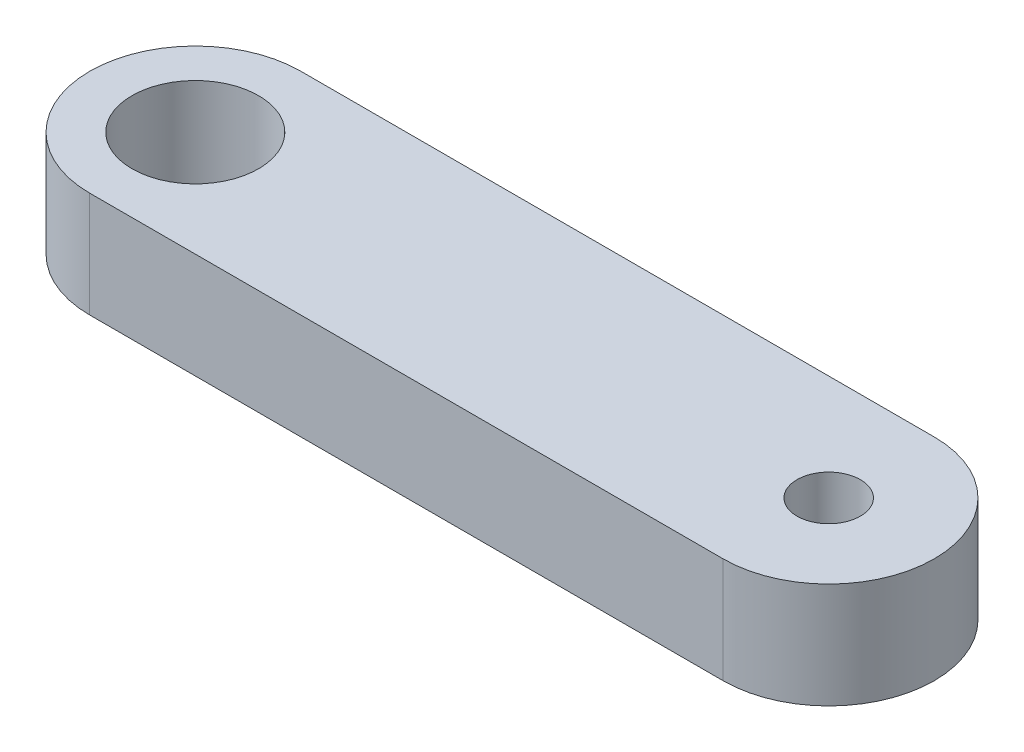
ISO-10303-21;
HEADER;
FILE_DESCRIPTION(('STEP AP214'),'2;1');
FILE_NAME('part.step','',(''),(''),'','','');
FILE_SCHEMA(('AUTOMOTIVE_DESIGN { 1 0 10303 214 1 1 1 1 }'));
ENDSEC;
DATA;
#1=APPLICATION_CONTEXT('core data for automotive mechanical design processes');
#2=APPLICATION_PROTOCOL_DEFINITION('international standard','automotive_design',2000,#1);
#3=PRODUCT_CONTEXT('',#1,'mechanical');
#4=PRODUCT('Part','Part','',(#3));
#5=PRODUCT_RELATED_PRODUCT_CATEGORY('part','',(#4));
#6=PRODUCT_DEFINITION_FORMATION('','',#4);
#7=PRODUCT_DEFINITION_CONTEXT('part definition',#1,'design');
#8=PRODUCT_DEFINITION('design','',#6,#7);
#9=PRODUCT_DEFINITION_SHAPE('','',#8);
#10=(LENGTH_UNIT() NAMED_UNIT(*) SI_UNIT(.MILLI.,.METRE.));
#11=(NAMED_UNIT(*) PLANE_ANGLE_UNIT() SI_UNIT($,.RADIAN.));
#12=(NAMED_UNIT(*) SI_UNIT($,.STERADIAN.) SOLID_ANGLE_UNIT());
#13=UNCERTAINTY_MEASURE_WITH_UNIT(LENGTH_MEASURE(1.E-05),#10,'distance_accuracy_value','');
#14=(GEOMETRIC_REPRESENTATION_CONTEXT(3) GLOBAL_UNCERTAINTY_ASSIGNED_CONTEXT((#13)) GLOBAL_UNIT_ASSIGNED_CONTEXT((#10,
#11,#12)) REPRESENTATION_CONTEXT('',''));
#15=CARTESIAN_POINT('',(0.,0.,0.));
#16=DIRECTION('',(0.,0.,1.));
#17=DIRECTION('',(1.,0.,0.));
#18=AXIS2_PLACEMENT_3D('',#15,#16,#17);
#19=CARTESIAN_POINT('',(0.,2.5,0.));
#20=DIRECTION('',(0.,-1.,0.));
#21=DIRECTION('',(0.,0.,-1.));
#22=AXIS2_PLACEMENT_3D('',#19,#20,#21);
#23=CYLINDRICAL_SURFACE('',#22,2.5);
#24=CARTESIAN_POINT('',(0.,0.,0.));
#25=DIRECTION('',(0.,1.,0.));
#26=DIRECTION('',(0.,0.,1.));
#27=AXIS2_PLACEMENT_3D('',#24,#25,#26);
#28=CIRCLE('',#27,2.5);
#29=CARTESIAN_POINT('',(0.,0.,-2.5));
#30=VERTEX_POINT('',#29);
#31=CARTESIAN_POINT('',(0.,0.,2.5));
#32=VERTEX_POINT('',#31);
#33=EDGE_CURVE('E111',#30,#32,#28,.T.);
#34=ORIENTED_EDGE('',*,*,#33,.T.);
#35=DIRECTION('',(0.,-1.,0.));
#36=VECTOR('',#35,1.);
#37=CARTESIAN_POINT('',(0.,2.5,2.5));
#38=LINE('',#37,#36);
#39=CARTESIAN_POINT('',(0.,2.5,2.5));
#40=VERTEX_POINT('',#39);
#41=EDGE_CURVE('E11',#40,#32,#38,.T.);
#42=ORIENTED_EDGE('',*,*,#41,.F.);
#43=CARTESIAN_POINT('',(0.,2.5,0.));
#44=DIRECTION('',(0.,1.,0.));
#45=DIRECTION('',(0.,0.,1.));
#46=AXIS2_PLACEMENT_3D('',#43,#44,#45);
#47=CIRCLE('',#46,2.5);
#48=CARTESIAN_POINT('',(0.,2.5,-2.5));
#49=VERTEX_POINT('',#48);
#50=EDGE_CURVE('E95',#49,#40,#47,.T.);
#51=ORIENTED_EDGE('',*,*,#50,.F.);
#52=DIRECTION('',(0.,-1.,0.));
#53=VECTOR('',#52,1.);
#54=CARTESIAN_POINT('',(0.,2.5,-2.5));
#55=LINE('',#54,#53);
#56=EDGE_CURVE('E107',#49,#30,#55,.T.);
#57=ORIENTED_EDGE('',*,*,#56,.T.);
#58=EDGE_LOOP('',(#34,#42,#51,#57));
#59=FACE_BOUND('',#58,.T.);
#60=ADVANCED_FACE('F43',(#59),#23,.T.);
#61=CARTESIAN_POINT('',(0.,2.5,2.5));
#62=DIRECTION('',(0.,0.,-1.));
#63=DIRECTION('',(-1.,0.,0.));
#64=AXIS2_PLACEMENT_3D('',#61,#62,#63);
#65=PLANE('',#64);
#66=DIRECTION('',(1.,0.,0.));
#67=VECTOR('',#66,1.);
#68=CARTESIAN_POINT('',(0.,0.,2.5));
#69=LINE('',#68,#67);
#70=CARTESIAN_POINT('',(15.,0.,2.5));
#71=VERTEX_POINT('',#70);
#72=EDGE_CURVE('E100',#32,#71,#69,.T.);
#73=ORIENTED_EDGE('',*,*,#72,.T.);
#74=DIRECTION('',(0.,-1.,0.));
#75=VECTOR('',#74,1.);
#76=CARTESIAN_POINT('',(15.,2.5,2.5));
#77=LINE('',#76,#75);
#78=CARTESIAN_POINT('',(15.,2.5,2.5));
#79=VERTEX_POINT('',#78);
#80=EDGE_CURVE('E52',#79,#71,#77,.T.);
#81=ORIENTED_EDGE('',*,*,#80,.F.);
#82=DIRECTION('',(1.,0.,0.));
#83=VECTOR('',#82,1.);
#84=CARTESIAN_POINT('',(0.,2.5,2.5));
#85=LINE('',#84,#83);
#86=EDGE_CURVE('E90',#40,#79,#85,.T.);
#87=ORIENTED_EDGE('',*,*,#86,.F.);
#88=ORIENTED_EDGE('',*,*,#41,.T.);
#89=EDGE_LOOP('',(#73,#81,#87,#88));
#90=FACE_BOUND('',#89,.T.);
#91=ADVANCED_FACE('F99',(#90),#65,.F.);
#92=CARTESIAN_POINT('',(15.,2.5,0.));
#93=DIRECTION('',(0.,-1.,0.));
#94=DIRECTION('',(0.,0.,-1.));
#95=AXIS2_PLACEMENT_3D('',#92,#93,#94);
#96=CYLINDRICAL_SURFACE('',#95,2.5);
#97=CARTESIAN_POINT('',(15.,0.,0.));
#98=DIRECTION('',(0.,1.,0.));
#99=DIRECTION('',(0.,0.,1.));
#100=AXIS2_PLACEMENT_3D('',#97,#98,#99);
#101=CIRCLE('',#100,2.5);
#102=CARTESIAN_POINT('',(15.,0.,-2.5));
#103=VERTEX_POINT('',#102);
#104=EDGE_CURVE('E77',#71,#103,#101,.T.);
#105=ORIENTED_EDGE('',*,*,#104,.T.);
#106=DIRECTION('',(0.,-1.,0.));
#107=VECTOR('',#106,1.);
#108=CARTESIAN_POINT('',(15.,2.5,-2.5));
#109=LINE('',#108,#107);
#110=CARTESIAN_POINT('',(15.,2.5,-2.5));
#111=VERTEX_POINT('',#110);
#112=EDGE_CURVE('E102',#111,#103,#109,.T.);
#113=ORIENTED_EDGE('',*,*,#112,.F.);
#114=CARTESIAN_POINT('',(15.,2.5,0.));
#115=DIRECTION('',(0.,1.,0.));
#116=DIRECTION('',(0.,0.,1.));
#117=AXIS2_PLACEMENT_3D('',#114,#115,#116);
#118=CIRCLE('',#117,2.5);
#119=EDGE_CURVE('E93',#79,#111,#118,.T.);
#120=ORIENTED_EDGE('',*,*,#119,.F.);
#121=ORIENTED_EDGE('',*,*,#80,.T.);
#122=EDGE_LOOP('',(#105,#113,#120,#121));
#123=FACE_BOUND('',#122,.T.);
#124=ADVANCED_FACE('F103',(#123),#96,.T.);
#125=CARTESIAN_POINT('',(0.,2.5,-2.5));
#126=DIRECTION('',(0.,0.,1.));
#127=DIRECTION('',(1.,0.,0.));
#128=AXIS2_PLACEMENT_3D('',#125,#126,#127);
#129=PLANE('',#128);
#130=DIRECTION('',(-1.,0.,0.));
#131=VECTOR('',#130,1.);
#132=CARTESIAN_POINT('',(0.,0.,-2.5));
#133=LINE('',#132,#131);
#134=EDGE_CURVE('E83',#103,#30,#133,.T.);
#135=ORIENTED_EDGE('',*,*,#134,.T.);
#136=ORIENTED_EDGE('',*,*,#56,.F.);
#137=DIRECTION('',(-1.,0.,0.));
#138=VECTOR('',#137,1.);
#139=CARTESIAN_POINT('',(0.,2.5,-2.5));
#140=LINE('',#139,#138);
#141=EDGE_CURVE('E60',#111,#49,#140,.T.);
#142=ORIENTED_EDGE('',*,*,#141,.F.);
#143=ORIENTED_EDGE('',*,*,#112,.T.);
#144=EDGE_LOOP('',(#135,#136,#142,#143));
#145=FACE_BOUND('',#144,.T.);
#146=ADVANCED_FACE('F125',(#145),#129,.F.);
#147=CARTESIAN_POINT('',(0.,2.5,0.));
#148=DIRECTION('',(0.,1.,0.));
#149=DIRECTION('',(0.,0.,1.));
#150=AXIS2_PLACEMENT_3D('',#147,#148,#149);
#151=PLANE('',#150);
#152=CARTESIAN_POINT('',(15.,2.5,0.));
#153=DIRECTION('',(0.,1.,0.));
#154=DIRECTION('',(0.,0.,1.));
#155=AXIS2_PLACEMENT_3D('',#152,#153,#154);
#156=CIRCLE('',#155,0.75);
#157=CARTESIAN_POINT('',(15.,2.5,0.75));
#158=VERTEX_POINT('',#157);
#159=EDGE_CURVE('E140',#158,#158,#156,.T.);
#160=ORIENTED_EDGE('',*,*,#159,.F.);
#161=EDGE_LOOP('',(#160));
#162=FACE_BOUND('',#161,.T.);
#163=CARTESIAN_POINT('',(0.,2.5,0.));
#164=DIRECTION('',(0.,1.,0.));
#165=DIRECTION('',(0.,0.,1.));
#166=AXIS2_PLACEMENT_3D('',#163,#164,#165);
#167=CIRCLE('',#166,1.5);
#168=CARTESIAN_POINT('',(0.,2.5,1.5));
#169=VERTEX_POINT('',#168);
#170=EDGE_CURVE('E132',#169,#169,#167,.T.);
#171=ORIENTED_EDGE('',*,*,#170,.F.);
#172=EDGE_LOOP('',(#171));
#173=FACE_BOUND('',#172,.T.);
#174=ORIENTED_EDGE('',*,*,#50,.T.);
#175=ORIENTED_EDGE('',*,*,#86,.T.);
#176=ORIENTED_EDGE('',*,*,#119,.T.);
#177=ORIENTED_EDGE('',*,*,#141,.T.);
#178=EDGE_LOOP('',(#174,#175,#176,#177));
#179=FACE_BOUND('',#178,.T.);
#180=ADVANCED_FACE('F91',(#162,#173,#179),#151,.T.);
#181=CARTESIAN_POINT('',(0.,0.,0.));
#182=DIRECTION('',(0.,1.,0.));
#183=DIRECTION('',(0.,0.,1.));
#184=AXIS2_PLACEMENT_3D('',#181,#182,#183);
#185=PLANE('',#184);
#186=CARTESIAN_POINT('',(15.,0.,0.));
#187=DIRECTION('',(0.,1.,0.));
#188=DIRECTION('',(0.,0.,1.));
#189=AXIS2_PLACEMENT_3D('',#186,#187,#188);
#190=CIRCLE('',#189,0.75);
#191=CARTESIAN_POINT('',(15.,0.,0.75));
#192=VERTEX_POINT('',#191);
#193=EDGE_CURVE('E136',#192,#192,#190,.T.);
#194=ORIENTED_EDGE('',*,*,#193,.T.);
#195=EDGE_LOOP('',(#194));
#196=FACE_BOUND('',#195,.T.);
#197=CARTESIAN_POINT('',(0.,0.,0.));
#198=DIRECTION('',(0.,1.,0.));
#199=DIRECTION('',(0.,0.,1.));
#200=AXIS2_PLACEMENT_3D('',#197,#198,#199);
#201=CIRCLE('',#200,1.5);
#202=CARTESIAN_POINT('',(0.,0.,1.5));
#203=VERTEX_POINT('',#202);
#204=EDGE_CURVE('E115',#203,#203,#201,.T.);
#205=ORIENTED_EDGE('',*,*,#204,.T.);
#206=EDGE_LOOP('',(#205));
#207=FACE_BOUND('',#206,.T.);
#208=ORIENTED_EDGE('',*,*,#33,.F.);
#209=ORIENTED_EDGE('',*,*,#134,.F.);
#210=ORIENTED_EDGE('',*,*,#104,.F.);
#211=ORIENTED_EDGE('',*,*,#72,.F.);
#212=EDGE_LOOP('',(#208,#209,#210,#211));
#213=FACE_BOUND('',#212,.T.);
#214=ADVANCED_FACE('F128',(#196,#207,#213),#185,.F.);
#215=CARTESIAN_POINT('',(0.,0.,0.));
#216=DIRECTION('',(0.,1.,0.));
#217=DIRECTION('',(0.,0.,1.));
#218=AXIS2_PLACEMENT_3D('',#215,#216,#217);
#219=CYLINDRICAL_SURFACE('',#218,1.5);
#220=ORIENTED_EDGE('',*,*,#204,.F.);
#221=EDGE_LOOP('',(#220));
#222=FACE_BOUND('',#221,.T.);
#223=ORIENTED_EDGE('',*,*,#170,.T.);
#224=EDGE_LOOP('',(#223));
#225=FACE_BOUND('',#224,.T.);
#226=ADVANCED_FACE('F153',(#222,#225),#219,.F.);
#227=CARTESIAN_POINT('',(15.,0.,0.));
#228=DIRECTION('',(0.,1.,0.));
#229=DIRECTION('',(0.,0.,1.));
#230=AXIS2_PLACEMENT_3D('',#227,#228,#229);
#231=CYLINDRICAL_SURFACE('',#230,0.75);
#232=ORIENTED_EDGE('',*,*,#193,.F.);
#233=EDGE_LOOP('',(#232));
#234=FACE_BOUND('',#233,.T.);
#235=ORIENTED_EDGE('',*,*,#159,.T.);
#236=EDGE_LOOP('',(#235));
#237=FACE_BOUND('',#236,.T.);
#238=ADVANCED_FACE('F150',(#234,#237),#231,.F.);
#239=CLOSED_SHELL('',(#60,#91,#124,#146,#180,#214,#226,#238));
#240=MANIFOLD_SOLID_BREP('B2',#239);
#241=ADVANCED_BREP_SHAPE_REPRESENTATION('',(#18,#240),#14);
#242=SHAPE_DEFINITION_REPRESENTATION(#9,#241);
ENDSEC;
END-ISO-10303-21;
